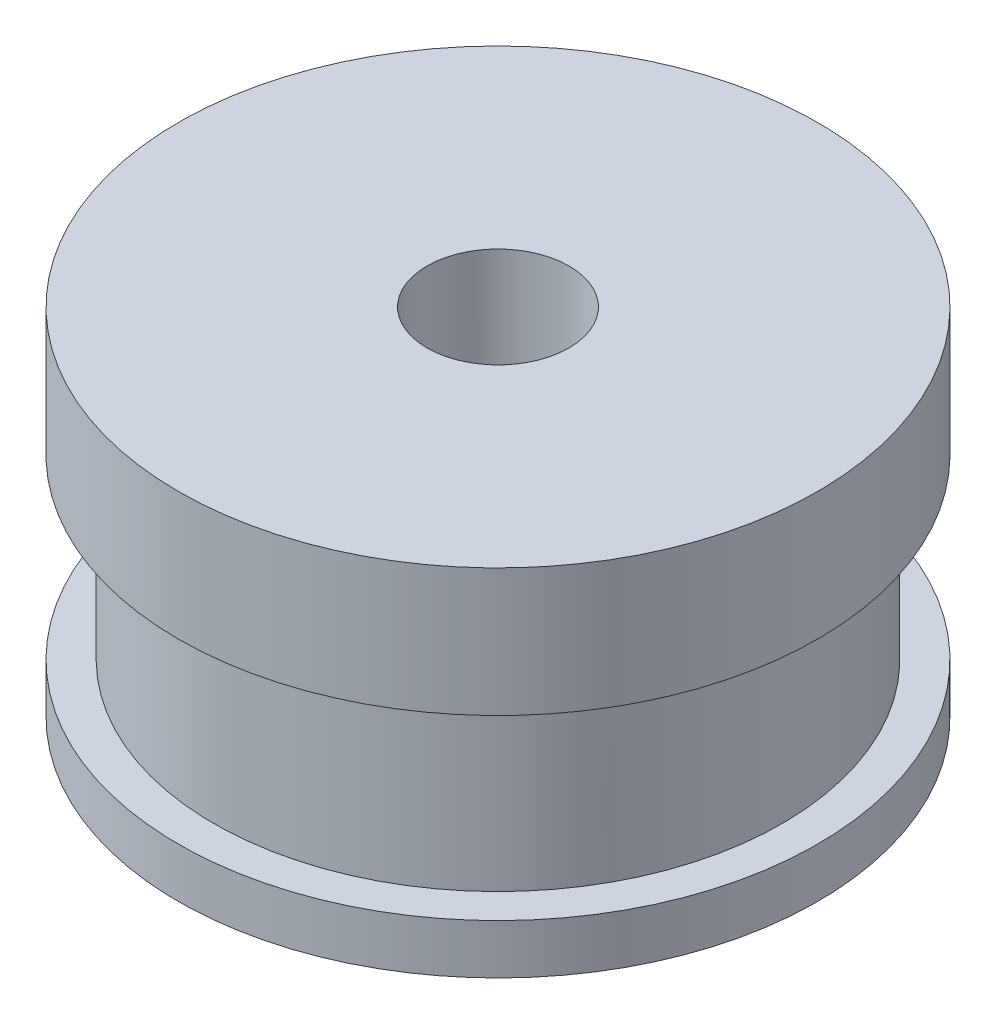
ISO-10303-21;
HEADER;
FILE_DESCRIPTION(('STEP AP214'),'2;1');
FILE_NAME('part.step','',(''),(''),'','','');
FILE_SCHEMA(('AUTOMOTIVE_DESIGN { 1 0 10303 214 1 1 1 1 }'));
ENDSEC;
DATA;
#1=APPLICATION_CONTEXT('core data for automotive mechanical design processes');
#2=APPLICATION_PROTOCOL_DEFINITION('international standard','automotive_design',2000,#1);
#3=PRODUCT_CONTEXT('',#1,'mechanical');
#4=PRODUCT('Part','Part','',(#3));
#5=PRODUCT_RELATED_PRODUCT_CATEGORY('part','',(#4));
#6=PRODUCT_DEFINITION_FORMATION('','',#4);
#7=PRODUCT_DEFINITION_CONTEXT('part definition',#1,'design');
#8=PRODUCT_DEFINITION('design','',#6,#7);
#9=PRODUCT_DEFINITION_SHAPE('','',#8);
#10=(LENGTH_UNIT() NAMED_UNIT(*) SI_UNIT(.MILLI.,.METRE.));
#11=(NAMED_UNIT(*) PLANE_ANGLE_UNIT() SI_UNIT($,.RADIAN.));
#12=(NAMED_UNIT(*) SI_UNIT($,.STERADIAN.) SOLID_ANGLE_UNIT());
#13=UNCERTAINTY_MEASURE_WITH_UNIT(LENGTH_MEASURE(1.E-05),#10,'distance_accuracy_value','');
#14=(GEOMETRIC_REPRESENTATION_CONTEXT(3) GLOBAL_UNCERTAINTY_ASSIGNED_CONTEXT((#13)) GLOBAL_UNIT_ASSIGNED_CONTEXT((#10,
#11,#12)) REPRESENTATION_CONTEXT('',''));
#15=CARTESIAN_POINT('',(0.,0.,0.));
#16=DIRECTION('',(0.,0.,1.));
#17=DIRECTION('',(1.,0.,0.));
#18=AXIS2_PLACEMENT_3D('',#15,#16,#17);
#19=CARTESIAN_POINT('',(0.,1.25,0.));
#20=DIRECTION('',(0.,-1.,0.));
#21=DIRECTION('',(0.,0.,-1.));
#22=AXIS2_PLACEMENT_3D('',#19,#20,#21);
#23=CYLINDRICAL_SURFACE('',#22,4.);
#24=CARTESIAN_POINT('',(0.,1.25,0.));
#25=DIRECTION('',(0.,1.,0.));
#26=DIRECTION('',(0.,0.,1.));
#27=AXIS2_PLACEMENT_3D('',#24,#25,#26);
#28=CIRCLE('',#27,4.);
#29=CARTESIAN_POINT('',(0.,1.25,4.));
#30=VERTEX_POINT('',#29);
#31=EDGE_CURVE('E10',#30,#30,#28,.T.);
#32=ORIENTED_EDGE('',*,*,#31,.F.);
#33=EDGE_LOOP('',(#32));
#34=FACE_BOUND('',#33,.T.);
#35=CARTESIAN_POINT('',(0.,-1.25,0.));
#36=DIRECTION('',(0.,-1.,0.));
#37=DIRECTION('',(0.,0.,-1.));
#38=AXIS2_PLACEMENT_3D('',#35,#36,#37);
#39=CIRCLE('',#38,4.);
#40=CARTESIAN_POINT('',(0.,-1.25,-4.));
#41=VERTEX_POINT('',#40);
#42=EDGE_CURVE('E47',#41,#41,#39,.T.);
#43=ORIENTED_EDGE('',*,*,#42,.F.);
#44=EDGE_LOOP('',(#43));
#45=FACE_BOUND('',#44,.T.);
#46=ADVANCED_FACE('F32',(#34,#45),#23,.T.);
#47=CARTESIAN_POINT('',(0.,1.25,0.));
#48=DIRECTION('',(0.,1.,0.));
#49=DIRECTION('',(0.,0.,1.));
#50=AXIS2_PLACEMENT_3D('',#47,#48,#49);
#51=PLANE('',#50);
#52=CARTESIAN_POINT('',(0.,1.25,0.));
#53=DIRECTION('',(0.,1.,0.));
#54=DIRECTION('',(0.,0.,1.));
#55=AXIS2_PLACEMENT_3D('',#52,#53,#54);
#56=CIRCLE('',#55,4.5);
#57=CARTESIAN_POINT('',(0.,1.25,4.5));
#58=VERTEX_POINT('',#57);
#59=EDGE_CURVE('E43',#58,#58,#56,.T.);
#60=ORIENTED_EDGE('',*,*,#59,.F.);
#61=EDGE_LOOP('',(#60));
#62=FACE_BOUND('',#61,.T.);
#63=ORIENTED_EDGE('',*,*,#31,.T.);
#64=EDGE_LOOP('',(#63));
#65=FACE_BOUND('',#64,.T.);
#66=ADVANCED_FACE('F90',(#62,#65),#51,.F.);
#67=CARTESIAN_POINT('',(0.,3.05,0.));
#68=DIRECTION('',(0.,-1.,0.));
#69=DIRECTION('',(0.,0.,-1.));
#70=AXIS2_PLACEMENT_3D('',#67,#68,#69);
#71=CYLINDRICAL_SURFACE('',#70,4.5);
#72=CARTESIAN_POINT('',(0.,3.05,0.));
#73=DIRECTION('',(0.,1.,0.));
#74=DIRECTION('',(0.,0.,1.));
#75=AXIS2_PLACEMENT_3D('',#72,#73,#74);
#76=CIRCLE('',#75,4.5);
#77=CARTESIAN_POINT('',(0.,3.05,4.5));
#78=VERTEX_POINT('',#77);
#79=EDGE_CURVE('E39',#78,#78,#76,.T.);
#80=ORIENTED_EDGE('',*,*,#79,.F.);
#81=EDGE_LOOP('',(#80));
#82=FACE_BOUND('',#81,.T.);
#83=ORIENTED_EDGE('',*,*,#59,.T.);
#84=EDGE_LOOP('',(#83));
#85=FACE_BOUND('',#84,.T.);
#86=ADVANCED_FACE('F95',(#82,#85),#71,.T.);
#87=CARTESIAN_POINT('',(0.,3.05,0.));
#88=DIRECTION('',(0.,1.,0.));
#89=DIRECTION('',(0.,0.,1.));
#90=AXIS2_PLACEMENT_3D('',#87,#88,#89);
#91=PLANE('',#90);
#92=CARTESIAN_POINT('',(0.,3.05,0.));
#93=DIRECTION('',(0.,1.,0.));
#94=DIRECTION('',(0.,0.,1.));
#95=AXIS2_PLACEMENT_3D('',#92,#93,#94);
#96=CIRCLE('',#95,1.);
#97=CARTESIAN_POINT('',(0.,3.05,1.));
#98=VERTEX_POINT('',#97);
#99=EDGE_CURVE('E35',#98,#98,#96,.T.);
#100=ORIENTED_EDGE('',*,*,#99,.F.);
#101=EDGE_LOOP('',(#100));
#102=FACE_BOUND('',#101,.T.);
#103=ORIENTED_EDGE('',*,*,#79,.T.);
#104=EDGE_LOOP('',(#103));
#105=FACE_BOUND('',#104,.T.);
#106=ADVANCED_FACE('F85',(#102,#105),#91,.T.);
#107=CARTESIAN_POINT('',(0.,-1.25,0.));
#108=DIRECTION('',(0.,-1.,0.));
#109=DIRECTION('',(0.,0.,-1.));
#110=AXIS2_PLACEMENT_3D('',#107,#108,#109);
#111=PLANE('',#110);
#112=CARTESIAN_POINT('',(0.,-1.25,0.));
#113=DIRECTION('',(0.,-1.,0.));
#114=DIRECTION('',(0.,0.,-1.));
#115=AXIS2_PLACEMENT_3D('',#112,#113,#114);
#116=CIRCLE('',#115,4.5);
#117=CARTESIAN_POINT('',(0.,-1.25,-4.5));
#118=VERTEX_POINT('',#117);
#119=EDGE_CURVE('E52',#118,#118,#116,.T.);
#120=ORIENTED_EDGE('',*,*,#119,.F.);
#121=EDGE_LOOP('',(#120));
#122=FACE_BOUND('',#121,.T.);
#123=ORIENTED_EDGE('',*,*,#42,.T.);
#124=EDGE_LOOP('',(#123));
#125=FACE_BOUND('',#124,.T.);
#126=ADVANCED_FACE('F79',(#122,#125),#111,.F.);
#127=CARTESIAN_POINT('',(0.,-1.95,0.));
#128=DIRECTION('',(0.,1.,0.));
#129=DIRECTION('',(0.,0.,1.));
#130=AXIS2_PLACEMENT_3D('',#127,#128,#129);
#131=CYLINDRICAL_SURFACE('',#130,4.5);
#132=CARTESIAN_POINT('',(0.,-1.95,0.));
#133=DIRECTION('',(0.,-1.,0.));
#134=DIRECTION('',(0.,0.,-1.));
#135=AXIS2_PLACEMENT_3D('',#132,#133,#134);
#136=CIRCLE('',#135,4.5);
#137=CARTESIAN_POINT('',(0.,-1.95,-4.5));
#138=VERTEX_POINT('',#137);
#139=EDGE_CURVE('E51',#138,#138,#136,.T.);
#140=ORIENTED_EDGE('',*,*,#139,.F.);
#141=EDGE_LOOP('',(#140));
#142=FACE_BOUND('',#141,.T.);
#143=ORIENTED_EDGE('',*,*,#119,.T.);
#144=EDGE_LOOP('',(#143));
#145=FACE_BOUND('',#144,.T.);
#146=ADVANCED_FACE('F73',(#142,#145),#131,.T.);
#147=CARTESIAN_POINT('',(0.,-1.95,0.));
#148=DIRECTION('',(0.,-1.,0.));
#149=DIRECTION('',(0.,0.,-1.));
#150=AXIS2_PLACEMENT_3D('',#147,#148,#149);
#151=PLANE('',#150);
#152=CARTESIAN_POINT('',(0.,-1.95,0.));
#153=DIRECTION('',(0.,-1.,0.));
#154=DIRECTION('',(0.,0.,-1.));
#155=AXIS2_PLACEMENT_3D('',#152,#153,#154);
#156=CIRCLE('',#155,2.);
#157=CARTESIAN_POINT('',(0.,-1.95,-2.));
#158=VERTEX_POINT('',#157);
#159=EDGE_CURVE('E63',#158,#158,#156,.T.);
#160=ORIENTED_EDGE('',*,*,#159,.F.);
#161=EDGE_LOOP('',(#160));
#162=FACE_BOUND('',#161,.T.);
#163=ORIENTED_EDGE('',*,*,#139,.T.);
#164=EDGE_LOOP('',(#163));
#165=FACE_BOUND('',#164,.T.);
#166=ADVANCED_FACE('F69',(#162,#165),#151,.T.);
#167=CARTESIAN_POINT('',(0.,-1.95,0.));
#168=DIRECTION('',(0.,-1.,0.));
#169=DIRECTION('',(0.,0.,-1.));
#170=AXIS2_PLACEMENT_3D('',#167,#168,#169);
#171=CYLINDRICAL_SURFACE('',#170,1.);
#172=ORIENTED_EDGE('',*,*,#99,.T.);
#173=EDGE_LOOP('',(#172));
#174=FACE_BOUND('',#173,.T.);
#175=CARTESIAN_POINT('',(0.,-0.349139380972446,0.));
#176=DIRECTION('',(0.,-1.,0.));
#177=DIRECTION('',(0.,0.,-1.));
#178=AXIS2_PLACEMENT_3D('',#175,#176,#177);
#179=CIRCLE('',#178,1.);
#180=CARTESIAN_POINT('',(0.,-0.349139380972446,-1.));
#181=VERTEX_POINT('',#180);
#182=EDGE_CURVE('E57',#181,#181,#179,.T.);
#183=ORIENTED_EDGE('',*,*,#182,.T.);
#184=EDGE_LOOP('',(#183));
#185=FACE_BOUND('',#184,.T.);
#186=ADVANCED_FACE('F72',(#174,#185),#171,.F.);
#187=CARTESIAN_POINT('',(0.,-0.950000000000003,0.));
#188=DIRECTION('',(0.,-1.,0.));
#189=DIRECTION('',(0.,0.,-1.));
#190=AXIS2_PLACEMENT_3D('',#187,#188,#189);
#191=CONICAL_SURFACE('',#190,2.,1.02974425867666);
#192=ORIENTED_EDGE('',*,*,#182,.F.);
#193=EDGE_LOOP('',(#192));
#194=FACE_BOUND('',#193,.T.);
#195=CARTESIAN_POINT('',(0.,-0.950000000000003,0.));
#196=DIRECTION('',(0.,-1.,0.));
#197=DIRECTION('',(0.,0.,-1.));
#198=AXIS2_PLACEMENT_3D('',#195,#196,#197);
#199=CIRCLE('',#198,2.);
#200=CARTESIAN_POINT('',(0.,-0.950000000000003,-2.));
#201=VERTEX_POINT('',#200);
#202=EDGE_CURVE('E60',#201,#201,#199,.T.);
#203=ORIENTED_EDGE('',*,*,#202,.T.);
#204=EDGE_LOOP('',(#203));
#205=FACE_BOUND('',#204,.T.);
#206=ADVANCED_FACE('F109',(#194,#205),#191,.F.);
#207=CARTESIAN_POINT('',(0.,-1.95,0.));
#208=DIRECTION('',(0.,-1.,0.));
#209=DIRECTION('',(0.,0.,-1.));
#210=AXIS2_PLACEMENT_3D('',#207,#208,#209);
#211=CYLINDRICAL_SURFACE('',#210,2.);
#212=ORIENTED_EDGE('',*,*,#202,.F.);
#213=EDGE_LOOP('',(#212));
#214=FACE_BOUND('',#213,.T.);
#215=ORIENTED_EDGE('',*,*,#159,.T.);
#216=EDGE_LOOP('',(#215));
#217=FACE_BOUND('',#216,.T.);
#218=ADVANCED_FACE('F67',(#214,#217),#211,.F.);
#219=CLOSED_SHELL('',(#46,#66,#86,#106,#126,#146,#166,#186,#206,#218));
#220=MANIFOLD_SOLID_BREP('B2',#219);
#221=ADVANCED_BREP_SHAPE_REPRESENTATION('',(#18,#220),#14);
#222=SHAPE_DEFINITION_REPRESENTATION(#9,#221);
ENDSEC;
END-ISO-10303-21;
